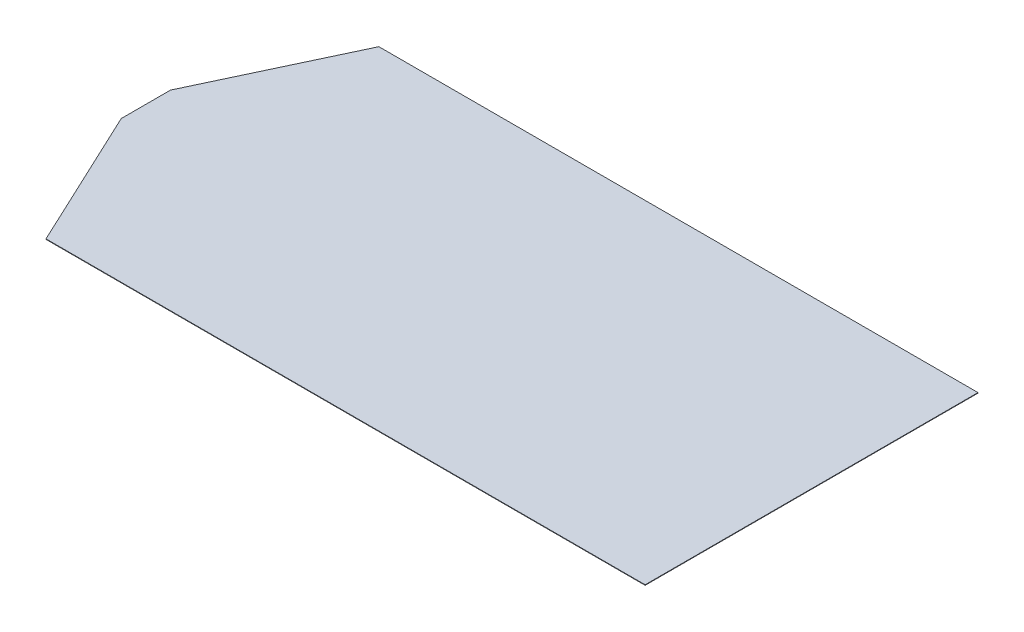
ISO-10303-21;
HEADER;
FILE_DESCRIPTION(('STEP AP214'),'2;1');
FILE_NAME('part.step','',(''),(''),'','','');
FILE_SCHEMA(('AUTOMOTIVE_DESIGN { 1 0 10303 214 1 1 1 1 }'));
ENDSEC;
DATA;
#1=APPLICATION_CONTEXT('core data for automotive mechanical design processes');
#2=APPLICATION_PROTOCOL_DEFINITION('international standard','automotive_design',2000,#1);
#3=PRODUCT_CONTEXT('',#1,'mechanical');
#4=PRODUCT('Part','Part','',(#3));
#5=PRODUCT_RELATED_PRODUCT_CATEGORY('part','',(#4));
#6=PRODUCT_DEFINITION_FORMATION('','',#4);
#7=PRODUCT_DEFINITION_CONTEXT('part definition',#1,'design');
#8=PRODUCT_DEFINITION('design','',#6,#7);
#9=PRODUCT_DEFINITION_SHAPE('','',#8);
#10=(LENGTH_UNIT() NAMED_UNIT(*) SI_UNIT(.MILLI.,.METRE.));
#11=(NAMED_UNIT(*) PLANE_ANGLE_UNIT() SI_UNIT($,.RADIAN.));
#12=(NAMED_UNIT(*) SI_UNIT($,.STERADIAN.) SOLID_ANGLE_UNIT());
#13=UNCERTAINTY_MEASURE_WITH_UNIT(LENGTH_MEASURE(1.E-05),#10,'distance_accuracy_value','');
#14=(GEOMETRIC_REPRESENTATION_CONTEXT(3) GLOBAL_UNCERTAINTY_ASSIGNED_CONTEXT((#13)) GLOBAL_UNIT_ASSIGNED_CONTEXT((#10,
#11,#12)) REPRESENTATION_CONTEXT('',''));
#15=CARTESIAN_POINT('',(0.,0.,0.));
#16=DIRECTION('',(0.,0.,1.));
#17=DIRECTION('',(1.,0.,0.));
#18=AXIS2_PLACEMENT_3D('',#15,#16,#17);
#19=CARTESIAN_POINT('',(900.,-1.5,500.));
#20=DIRECTION('',(1.,0.,0.));
#21=DIRECTION('',(0.,0.,-1.));
#22=AXIS2_PLACEMENT_3D('',#19,#20,#21);
#23=PLANE('',#22);
#24=DIRECTION('',(0.,0.,-1.));
#25=VECTOR('',#24,1.);
#26=CARTESIAN_POINT('',(900.,0.,500.));
#27=LINE('',#26,#25);
#28=CARTESIAN_POINT('',(900.,0.,500.));
#29=VERTEX_POINT('',#28);
#30=CARTESIAN_POINT('',(900.,0.,-500.));
#31=VERTEX_POINT('',#30);
#32=EDGE_CURVE('E124',#29,#31,#27,.T.);
#33=ORIENTED_EDGE('',*,*,#32,.F.);
#34=DIRECTION('',(0.,1.,0.));
#35=VECTOR('',#34,1.);
#36=CARTESIAN_POINT('',(900.,-1.5,500.));
#37=LINE('',#36,#35);
#38=CARTESIAN_POINT('',(900.,-1.5,500.));
#39=VERTEX_POINT('',#38);
#40=EDGE_CURVE('E11',#39,#29,#37,.T.);
#41=ORIENTED_EDGE('',*,*,#40,.F.);
#42=DIRECTION('',(0.,0.,-1.));
#43=VECTOR('',#42,1.);
#44=CARTESIAN_POINT('',(900.,-1.5,500.));
#45=LINE('',#44,#43);
#46=CARTESIAN_POINT('',(900.,-1.5,-500.));
#47=VERTEX_POINT('',#46);
#48=EDGE_CURVE('E138',#39,#47,#45,.T.);
#49=ORIENTED_EDGE('',*,*,#48,.T.);
#50=DIRECTION('',(0.,1.,0.));
#51=VECTOR('',#50,1.);
#52=CARTESIAN_POINT('',(900.,-1.5,-500.));
#53=LINE('',#52,#51);
#54=EDGE_CURVE('E42',#47,#31,#53,.T.);
#55=ORIENTED_EDGE('',*,*,#54,.T.);
#56=EDGE_LOOP('',(#33,#41,#49,#55));
#57=FACE_BOUND('',#56,.T.);
#58=ADVANCED_FACE('F39',(#57),#23,.T.);
#59=CARTESIAN_POINT('',(-900.,-1.5,500.));
#60=DIRECTION('',(0.,0.,1.));
#61=DIRECTION('',(1.,0.,0.));
#62=AXIS2_PLACEMENT_3D('',#59,#60,#61);
#63=PLANE('',#62);
#64=DIRECTION('',(1.,0.,0.));
#65=VECTOR('',#64,1.);
#66=CARTESIAN_POINT('',(-900.,0.,500.));
#67=LINE('',#66,#65);
#68=CARTESIAN_POINT('',(-900.,0.,500.));
#69=VERTEX_POINT('',#68);
#70=EDGE_CURVE('E136',#69,#29,#67,.T.);
#71=ORIENTED_EDGE('',*,*,#70,.F.);
#72=DIRECTION('',(0.,1.,0.));
#73=VECTOR('',#72,1.);
#74=CARTESIAN_POINT('',(-900.,-1.5,500.));
#75=LINE('',#74,#73);
#76=CARTESIAN_POINT('',(-900.,-1.5,500.));
#77=VERTEX_POINT('',#76);
#78=EDGE_CURVE('E48',#77,#69,#75,.T.);
#79=ORIENTED_EDGE('',*,*,#78,.F.);
#80=DIRECTION('',(1.,0.,0.));
#81=VECTOR('',#80,1.);
#82=CARTESIAN_POINT('',(-900.,-1.5,500.));
#83=LINE('',#82,#81);
#84=EDGE_CURVE('E114',#77,#39,#83,.T.);
#85=ORIENTED_EDGE('',*,*,#84,.T.);
#86=ORIENTED_EDGE('',*,*,#40,.T.);
#87=EDGE_LOOP('',(#71,#79,#85,#86));
#88=FACE_BOUND('',#87,.T.);
#89=ADVANCED_FACE('F146',(#88),#63,.T.);
#90=CARTESIAN_POINT('',(-1100.,-1.5,74.));
#91=DIRECTION('',(-0.905203581219027,0.,0.424978207145083));
#92=DIRECTION('',(0.424978207145083,0.,0.905203581219027));
#93=AXIS2_PLACEMENT_3D('',#90,#91,#92);
#94=PLANE('',#93);
#95=DIRECTION('',(0.424978207145083,0.,0.905203581219027));
#96=VECTOR('',#95,1.);
#97=CARTESIAN_POINT('',(-1100.,0.,74.));
#98=LINE('',#97,#96);
#99=CARTESIAN_POINT('',(-1100.,0.,74.));
#100=VERTEX_POINT('',#99);
#101=EDGE_CURVE('E101',#100,#69,#98,.T.);
#102=ORIENTED_EDGE('',*,*,#101,.F.);
#103=DIRECTION('',(0.,1.,0.));
#104=VECTOR('',#103,1.);
#105=CARTESIAN_POINT('',(-1100.,-1.5,74.));
#106=LINE('',#105,#104);
#107=CARTESIAN_POINT('',(-1100.,-1.5,74.));
#108=VERTEX_POINT('',#107);
#109=EDGE_CURVE('E96',#108,#100,#106,.T.);
#110=ORIENTED_EDGE('',*,*,#109,.F.);
#111=DIRECTION('',(0.424978207145083,0.,0.905203581219027));
#112=VECTOR('',#111,1.);
#113=CARTESIAN_POINT('',(-1100.,-1.5,74.));
#114=LINE('',#113,#112);
#115=EDGE_CURVE('E99',#108,#77,#114,.T.);
#116=ORIENTED_EDGE('',*,*,#115,.T.);
#117=ORIENTED_EDGE('',*,*,#78,.T.);
#118=EDGE_LOOP('',(#102,#110,#116,#117));
#119=FACE_BOUND('',#118,.T.);
#120=ADVANCED_FACE('F98',(#119),#94,.T.);
#121=CARTESIAN_POINT('',(-1100.,-1.5,-74.));
#122=DIRECTION('',(-1.,0.,0.));
#123=DIRECTION('',(0.,0.,1.));
#124=AXIS2_PLACEMENT_3D('',#121,#122,#123);
#125=PLANE('',#124);
#126=DIRECTION('',(0.,0.,1.));
#127=VECTOR('',#126,1.);
#128=CARTESIAN_POINT('',(-1100.,0.,-74.));
#129=LINE('',#128,#127);
#130=CARTESIAN_POINT('',(-1100.,0.,-74.));
#131=VERTEX_POINT('',#130);
#132=EDGE_CURVE('E133',#131,#100,#129,.T.);
#133=ORIENTED_EDGE('',*,*,#132,.F.);
#134=DIRECTION('',(0.,1.,0.));
#135=VECTOR('',#134,1.);
#136=CARTESIAN_POINT('',(-1100.,-1.5,-74.));
#137=LINE('',#136,#135);
#138=CARTESIAN_POINT('',(-1100.,-1.5,-74.));
#139=VERTEX_POINT('',#138);
#140=EDGE_CURVE('E106',#139,#131,#137,.T.);
#141=ORIENTED_EDGE('',*,*,#140,.F.);
#142=DIRECTION('',(0.,0.,1.));
#143=VECTOR('',#142,1.);
#144=CARTESIAN_POINT('',(-1100.,-1.5,-74.));
#145=LINE('',#144,#143);
#146=EDGE_CURVE('E112',#139,#108,#145,.T.);
#147=ORIENTED_EDGE('',*,*,#146,.T.);
#148=ORIENTED_EDGE('',*,*,#109,.T.);
#149=EDGE_LOOP('',(#133,#141,#147,#148));
#150=FACE_BOUND('',#149,.T.);
#151=ADVANCED_FACE('F116',(#150),#125,.T.);
#152=CARTESIAN_POINT('',(-900.,-1.5,-500.));
#153=DIRECTION('',(-0.905203581219027,0.,-0.424978207145083));
#154=DIRECTION('',(-0.424978207145083,0.,0.905203581219027));
#155=AXIS2_PLACEMENT_3D('',#152,#153,#154);
#156=PLANE('',#155);
#157=DIRECTION('',(-0.424978207145083,0.,0.905203581219027));
#158=VECTOR('',#157,1.);
#159=CARTESIAN_POINT('',(-900.,0.,-500.));
#160=LINE('',#159,#158);
#161=CARTESIAN_POINT('',(-900.,0.,-500.));
#162=VERTEX_POINT('',#161);
#163=EDGE_CURVE('E130',#162,#131,#160,.T.);
#164=ORIENTED_EDGE('',*,*,#163,.F.);
#165=DIRECTION('',(0.,1.,0.));
#166=VECTOR('',#165,1.);
#167=CARTESIAN_POINT('',(-900.,-1.5,-500.));
#168=LINE('',#167,#166);
#169=CARTESIAN_POINT('',(-900.,-1.5,-500.));
#170=VERTEX_POINT('',#169);
#171=EDGE_CURVE('E141',#170,#162,#168,.T.);
#172=ORIENTED_EDGE('',*,*,#171,.F.);
#173=DIRECTION('',(-0.424978207145083,0.,0.905203581219027));
#174=VECTOR('',#173,1.);
#175=CARTESIAN_POINT('',(-900.,-1.5,-500.));
#176=LINE('',#175,#174);
#177=EDGE_CURVE('E117',#170,#139,#176,.T.);
#178=ORIENTED_EDGE('',*,*,#177,.T.);
#179=ORIENTED_EDGE('',*,*,#140,.T.);
#180=EDGE_LOOP('',(#164,#172,#178,#179));
#181=FACE_BOUND('',#180,.T.);
#182=ADVANCED_FACE('F159',(#181),#156,.T.);
#183=CARTESIAN_POINT('',(-900.,-1.5,-500.));
#184=DIRECTION('',(0.,0.,-1.));
#185=DIRECTION('',(-1.,0.,0.));
#186=AXIS2_PLACEMENT_3D('',#183,#184,#185);
#187=PLANE('',#186);
#188=DIRECTION('',(-1.,0.,0.));
#189=VECTOR('',#188,1.);
#190=CARTESIAN_POINT('',(-900.,0.,-500.));
#191=LINE('',#190,#189);
#192=EDGE_CURVE('E127',#31,#162,#191,.T.);
#193=ORIENTED_EDGE('',*,*,#192,.F.);
#194=ORIENTED_EDGE('',*,*,#54,.F.);
#195=DIRECTION('',(-1.,0.,0.));
#196=VECTOR('',#195,1.);
#197=CARTESIAN_POINT('',(-900.,-1.5,-500.));
#198=LINE('',#197,#196);
#199=EDGE_CURVE('E119',#47,#170,#198,.T.);
#200=ORIENTED_EDGE('',*,*,#199,.T.);
#201=ORIENTED_EDGE('',*,*,#171,.T.);
#202=EDGE_LOOP('',(#193,#194,#200,#201));
#203=FACE_BOUND('',#202,.T.);
#204=ADVANCED_FACE('F143',(#203),#187,.T.);
#205=CARTESIAN_POINT('',(0.,-1.5,0.));
#206=DIRECTION('',(0.,-1.,0.));
#207=DIRECTION('',(0.,0.,-1.));
#208=AXIS2_PLACEMENT_3D('',#205,#206,#207);
#209=PLANE('',#208);
#210=ORIENTED_EDGE('',*,*,#48,.F.);
#211=ORIENTED_EDGE('',*,*,#84,.F.);
#212=ORIENTED_EDGE('',*,*,#115,.F.);
#213=ORIENTED_EDGE('',*,*,#146,.F.);
#214=ORIENTED_EDGE('',*,*,#177,.F.);
#215=ORIENTED_EDGE('',*,*,#199,.F.);
#216=EDGE_LOOP('',(#210,#211,#212,#213,#214,#215));
#217=FACE_BOUND('',#216,.T.);
#218=ADVANCED_FACE('F110',(#217),#209,.T.);
#219=CARTESIAN_POINT('',(0.,0.,0.));
#220=DIRECTION('',(0.,-1.,0.));
#221=DIRECTION('',(0.,0.,-1.));
#222=AXIS2_PLACEMENT_3D('',#219,#220,#221);
#223=PLANE('',#222);
#224=ORIENTED_EDGE('',*,*,#32,.T.);
#225=ORIENTED_EDGE('',*,*,#192,.T.);
#226=ORIENTED_EDGE('',*,*,#163,.T.);
#227=ORIENTED_EDGE('',*,*,#132,.T.);
#228=ORIENTED_EDGE('',*,*,#101,.T.);
#229=ORIENTED_EDGE('',*,*,#70,.T.);
#230=EDGE_LOOP('',(#224,#225,#226,#227,#228,#229));
#231=FACE_BOUND('',#230,.T.);
#232=ADVANCED_FACE('F145',(#231),#223,.F.);
#233=CLOSED_SHELL('',(#58,#89,#120,#151,#182,#204,#218,#232));
#234=MANIFOLD_SOLID_BREP('B2',#233);
#235=ADVANCED_BREP_SHAPE_REPRESENTATION('',(#18,#234),#14);
#236=SHAPE_DEFINITION_REPRESENTATION(#9,#235);
ENDSEC;
END-ISO-10303-21;
